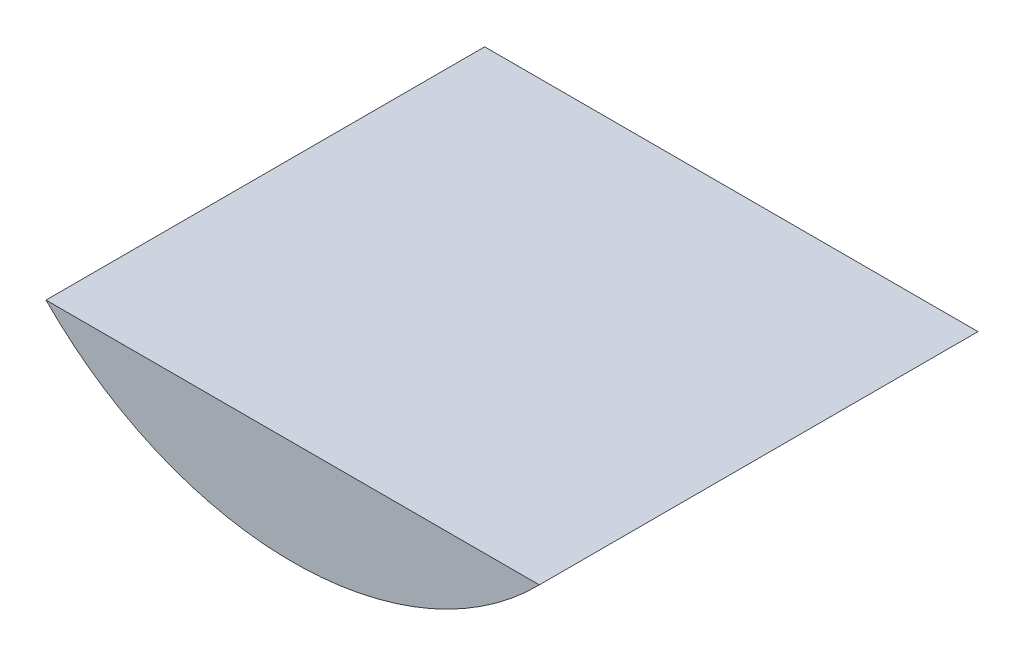
ISO-10303-21;
HEADER;
FILE_DESCRIPTION(('STEP AP214'),'2;1');
FILE_NAME('part.step','',(''),(''),'','','');
FILE_SCHEMA(('AUTOMOTIVE_DESIGN { 1 0 10303 214 1 1 1 1 }'));
ENDSEC;
DATA;
#1=APPLICATION_CONTEXT('core data for automotive mechanical design processes');
#2=APPLICATION_PROTOCOL_DEFINITION('international standard','automotive_design',2000,#1);
#3=PRODUCT_CONTEXT('',#1,'mechanical');
#4=PRODUCT('Part','Part','',(#3));
#5=PRODUCT_RELATED_PRODUCT_CATEGORY('part','',(#4));
#6=PRODUCT_DEFINITION_FORMATION('','',#4);
#7=PRODUCT_DEFINITION_CONTEXT('part definition',#1,'design');
#8=PRODUCT_DEFINITION('design','',#6,#7);
#9=PRODUCT_DEFINITION_SHAPE('','',#8);
#10=(LENGTH_UNIT() NAMED_UNIT(*) SI_UNIT(.MILLI.,.METRE.));
#11=(NAMED_UNIT(*) PLANE_ANGLE_UNIT() SI_UNIT($,.RADIAN.));
#12=(NAMED_UNIT(*) SI_UNIT($,.STERADIAN.) SOLID_ANGLE_UNIT());
#13=UNCERTAINTY_MEASURE_WITH_UNIT(LENGTH_MEASURE(1.E-05),#10,'distance_accuracy_value','');
#14=(GEOMETRIC_REPRESENTATION_CONTEXT(3) GLOBAL_UNCERTAINTY_ASSIGNED_CONTEXT((#13)) GLOBAL_UNIT_ASSIGNED_CONTEXT((#10,
#11,#12)) REPRESENTATION_CONTEXT('',''));
#15=CARTESIAN_POINT('',(0.,0.,0.));
#16=DIRECTION('',(0.,0.,1.));
#17=DIRECTION('',(1.,0.,0.));
#18=AXIS2_PLACEMENT_3D('',#15,#16,#17);
#19=CARTESIAN_POINT('',(0.,0.,127.));
#20=DIRECTION('',(0.,0.,-1.));
#21=DIRECTION('',(-1.,0.,0.));
#22=AXIS2_PLACEMENT_3D('',#19,#20,#21);
#23=CYLINDRICAL_SURFACE('',#22,100.);
#24=CARTESIAN_POINT('',(0.,0.,0.));
#25=DIRECTION('',(0.,0.,1.));
#26=DIRECTION('',(1.,0.,0.));
#27=AXIS2_PLACEMENT_3D('',#24,#25,#26);
#28=CIRCLE('',#27,100.);
#29=CARTESIAN_POINT('',(-71.4142842854285,-70.,0.));
#30=VERTEX_POINT('',#29);
#31=CARTESIAN_POINT('',(71.4142842854285,-70.,0.));
#32=VERTEX_POINT('',#31);
#33=EDGE_CURVE('E67',#30,#32,#28,.T.);
#34=ORIENTED_EDGE('',*,*,#33,.T.);
#35=DIRECTION('',(0.,0.,-1.));
#36=VECTOR('',#35,1.);
#37=CARTESIAN_POINT('',(71.4142842854285,-70.,127.));
#38=LINE('',#37,#36);
#39=CARTESIAN_POINT('',(71.4142842854285,-70.,127.));
#40=VERTEX_POINT('',#39);
#41=EDGE_CURVE('E11',#40,#32,#38,.T.);
#42=ORIENTED_EDGE('',*,*,#41,.F.);
#43=CARTESIAN_POINT('',(0.,0.,127.));
#44=DIRECTION('',(0.,0.,1.));
#45=DIRECTION('',(1.,0.,0.));
#46=AXIS2_PLACEMENT_3D('',#43,#44,#45);
#47=CIRCLE('',#46,100.);
#48=CARTESIAN_POINT('',(-71.4142842854285,-70.,127.));
#49=VERTEX_POINT('',#48);
#50=EDGE_CURVE('E66',#49,#40,#47,.T.);
#51=ORIENTED_EDGE('',*,*,#50,.F.);
#52=DIRECTION('',(0.,0.,-1.));
#53=VECTOR('',#52,1.);
#54=CARTESIAN_POINT('',(-71.4142842854285,-70.,127.));
#55=LINE('',#54,#53);
#56=EDGE_CURVE('E44',#49,#30,#55,.T.);
#57=ORIENTED_EDGE('',*,*,#56,.T.);
#58=EDGE_LOOP('',(#34,#42,#51,#57));
#59=FACE_BOUND('',#58,.T.);
#60=ADVANCED_FACE('F36',(#59),#23,.T.);
#61=CARTESIAN_POINT('',(-71.4142842854285,-70.,127.));
#62=DIRECTION('',(0.,-1.,0.));
#63=DIRECTION('',(0.,0.,-1.));
#64=AXIS2_PLACEMENT_3D('',#61,#62,#63);
#65=PLANE('',#64);
#66=DIRECTION('',(-1.,0.,0.));
#67=VECTOR('',#66,1.);
#68=CARTESIAN_POINT('',(-71.4142842854285,-70.,0.));
#69=LINE('',#68,#67);
#70=EDGE_CURVE('E59',#32,#30,#69,.T.);
#71=ORIENTED_EDGE('',*,*,#70,.T.);
#72=ORIENTED_EDGE('',*,*,#56,.F.);
#73=DIRECTION('',(-1.,0.,0.));
#74=VECTOR('',#73,1.);
#75=CARTESIAN_POINT('',(-71.4142842854285,-70.,127.));
#76=LINE('',#75,#74);
#77=EDGE_CURVE('E51',#40,#49,#76,.T.);
#78=ORIENTED_EDGE('',*,*,#77,.F.);
#79=ORIENTED_EDGE('',*,*,#41,.T.);
#80=EDGE_LOOP('',(#71,#72,#78,#79));
#81=FACE_BOUND('',#80,.T.);
#82=ADVANCED_FACE('F62',(#81),#65,.F.);
#83=CARTESIAN_POINT('',(0.,0.,127.));
#84=DIRECTION('',(0.,0.,1.));
#85=DIRECTION('',(1.,0.,0.));
#86=AXIS2_PLACEMENT_3D('',#83,#84,#85);
#87=PLANE('',#86);
#88=ORIENTED_EDGE('',*,*,#50,.T.);
#89=ORIENTED_EDGE('',*,*,#77,.T.);
#90=EDGE_LOOP('',(#88,#89));
#91=FACE_BOUND('',#90,.T.);
#92=ADVANCED_FACE('F74',(#91),#87,.T.);
#93=CARTESIAN_POINT('',(0.,0.,0.));
#94=DIRECTION('',(0.,0.,1.));
#95=DIRECTION('',(1.,0.,0.));
#96=AXIS2_PLACEMENT_3D('',#93,#94,#95);
#97=PLANE('',#96);
#98=ORIENTED_EDGE('',*,*,#33,.F.);
#99=ORIENTED_EDGE('',*,*,#70,.F.);
#100=EDGE_LOOP('',(#98,#99));
#101=FACE_BOUND('',#100,.T.);
#102=ADVANCED_FACE('F70',(#101),#97,.F.);
#103=CLOSED_SHELL('',(#60,#82,#92,#102));
#104=MANIFOLD_SOLID_BREP('B2',#103);
#105=ADVANCED_BREP_SHAPE_REPRESENTATION('',(#18,#104),#14);
#106=SHAPE_DEFINITION_REPRESENTATION(#9,#105);
ENDSEC;
END-ISO-10303-21;
